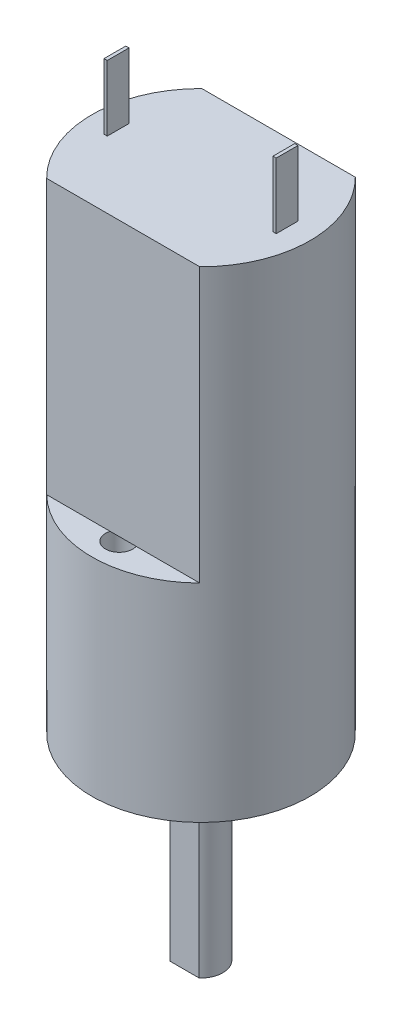
ISO-10303-21;
HEADER;
FILE_DESCRIPTION(('STEP AP214'),'2;1');
FILE_NAME('part.step','',(''),(''),'','','');
FILE_SCHEMA(('AUTOMOTIVE_DESIGN { 1 0 10303 214 1 1 1 1 }'));
ENDSEC;
DATA;
#1=APPLICATION_CONTEXT('core data for automotive mechanical design processes');
#2=APPLICATION_PROTOCOL_DEFINITION('international standard','automotive_design',2000,#1);
#3=PRODUCT_CONTEXT('',#1,'mechanical');
#4=PRODUCT('Part','Part','',(#3));
#5=PRODUCT_RELATED_PRODUCT_CATEGORY('part','',(#4));
#6=PRODUCT_DEFINITION_FORMATION('','',#4);
#7=PRODUCT_DEFINITION_CONTEXT('part definition',#1,'design');
#8=PRODUCT_DEFINITION('design','',#6,#7);
#9=PRODUCT_DEFINITION_SHAPE('','',#8);
#10=(LENGTH_UNIT() NAMED_UNIT(*) SI_UNIT(.MILLI.,.METRE.));
#11=(NAMED_UNIT(*) PLANE_ANGLE_UNIT() SI_UNIT($,.RADIAN.));
#12=(NAMED_UNIT(*) SI_UNIT($,.STERADIAN.) SOLID_ANGLE_UNIT());
#13=UNCERTAINTY_MEASURE_WITH_UNIT(LENGTH_MEASURE(1.E-05),#10,'distance_accuracy_value','');
#14=(GEOMETRIC_REPRESENTATION_CONTEXT(3) GLOBAL_UNCERTAINTY_ASSIGNED_CONTEXT((#13)) GLOBAL_UNIT_ASSIGNED_CONTEXT((#10,
#11,#12)) REPRESENTATION_CONTEXT('',''));
#15=CARTESIAN_POINT('',(0.,0.,0.));
#16=DIRECTION('',(0.,0.,1.));
#17=DIRECTION('',(1.,0.,0.));
#18=AXIS2_PLACEMENT_3D('',#15,#16,#17);
#19=CARTESIAN_POINT('',(0.,25.1,0.));
#20=DIRECTION('',(0.,1.,0.));
#21=DIRECTION('',(-1.,0.,0.));
#22=AXIS2_PLACEMENT_3D('',#19,#20,#21);
#23=PLANE('',#22);
#24=DIRECTION('',(0.,0.,-1.));
#25=VECTOR('',#24,1.);
#26=CARTESIAN_POINT('',(-7.892,25.1,0.));
#27=LINE('',#26,#25);
#28=CARTESIAN_POINT('',(-7.892,25.1,1.));
#29=VERTEX_POINT('',#28);
#30=CARTESIAN_POINT('',(-7.892,25.1,-1.));
#31=VERTEX_POINT('',#30);
#32=EDGE_CURVE('E174',#29,#31,#27,.T.);
#33=ORIENTED_EDGE('',*,*,#32,.T.);
#34=DIRECTION('',(1.,0.,0.));
#35=VECTOR('',#34,1.);
#36=CARTESIAN_POINT('',(-7.742,25.1,-1.));
#37=LINE('',#36,#35);
#38=CARTESIAN_POINT('',(-7.592,25.1,-1.));
#39=VERTEX_POINT('',#38);
#40=EDGE_CURVE('E193',#31,#39,#37,.T.);
#41=ORIENTED_EDGE('',*,*,#40,.T.);
#42=DIRECTION('',(0.,0.,-1.));
#43=VECTOR('',#42,1.);
#44=CARTESIAN_POINT('',(-7.592,25.1,0.));
#45=LINE('',#44,#43);
#46=CARTESIAN_POINT('',(-7.592,25.1,1.));
#47=VERTEX_POINT('',#46);
#48=EDGE_CURVE('E47',#47,#39,#45,.T.);
#49=ORIENTED_EDGE('',*,*,#48,.F.);
#50=DIRECTION('',(1.,0.,0.));
#51=VECTOR('',#50,1.);
#52=CARTESIAN_POINT('',(-7.742,25.1,1.));
#53=LINE('',#52,#51);
#54=EDGE_CURVE('E39',#29,#47,#53,.T.);
#55=ORIENTED_EDGE('',*,*,#54,.F.);
#56=EDGE_LOOP('',(#33,#41,#49,#55));
#57=FACE_BOUND('',#56,.T.);
#58=DIRECTION('',(-1.,0.,0.));
#59=VECTOR('',#58,1.);
#60=CARTESIAN_POINT('',(0.,25.1,7.12912500727686));
#61=LINE('',#60,#59);
#62=CARTESIAN_POINT('',(7.01252997359867,25.1,7.12912500727686));
#63=VERTEX_POINT('',#62);
#64=CARTESIAN_POINT('',(-7.01252997359867,25.1,7.12912500727686));
#65=VERTEX_POINT('',#64);
#66=EDGE_CURVE('E273',#63,#65,#61,.T.);
#67=ORIENTED_EDGE('',*,*,#66,.F.);
#68=CARTESIAN_POINT('',(0.,25.1,0.));
#69=DIRECTION('',(0.,-1.,0.));
#70=DIRECTION('',(0.,0.,-1.));
#71=AXIS2_PLACEMENT_3D('',#68,#69,#70);
#72=CIRCLE('',#71,10.);
#73=CARTESIAN_POINT('',(7.03507838178129,25.1,-7.10687499272314));
#74=VERTEX_POINT('',#73);
#75=EDGE_CURVE('E302',#74,#63,#72,.T.);
#76=ORIENTED_EDGE('',*,*,#75,.F.);
#77=DIRECTION('',(-1.,0.,0.));
#78=VECTOR('',#77,1.);
#79=CARTESIAN_POINT('',(0.,25.1,-7.10687499272314));
#80=LINE('',#79,#78);
#81=CARTESIAN_POINT('',(-7.03507838178129,25.1,-7.10687499272314));
#82=VERTEX_POINT('',#81);
#83=EDGE_CURVE('E250',#74,#82,#80,.T.);
#84=ORIENTED_EDGE('',*,*,#83,.T.);
#85=EDGE_CURVE('E307',#65,#82,#72,.T.);
#86=ORIENTED_EDGE('',*,*,#85,.F.);
#87=EDGE_LOOP('',(#67,#76,#84,#86));
#88=FACE_BOUND('',#87,.T.);
#89=DIRECTION('',(0.,0.,-1.));
#90=VECTOR('',#89,1.);
#91=CARTESIAN_POINT('',(7.892,25.1,0.));
#92=LINE('',#91,#90);
#93=CARTESIAN_POINT('',(7.892,25.1,1.));
#94=VERTEX_POINT('',#93);
#95=CARTESIAN_POINT('',(7.892,25.1,-1.));
#96=VERTEX_POINT('',#95);
#97=EDGE_CURVE('E240',#94,#96,#92,.T.);
#98=ORIENTED_EDGE('',*,*,#97,.F.);
#99=DIRECTION('',(-1.,0.,0.));
#100=VECTOR('',#99,1.);
#101=CARTESIAN_POINT('',(7.742,25.1,1.));
#102=LINE('',#101,#100);
#103=CARTESIAN_POINT('',(7.592,25.1,1.));
#104=VERTEX_POINT('',#103);
#105=EDGE_CURVE('E223',#94,#104,#102,.T.);
#106=ORIENTED_EDGE('',*,*,#105,.T.);
#107=DIRECTION('',(0.,0.,-1.));
#108=VECTOR('',#107,1.);
#109=CARTESIAN_POINT('',(7.592,25.1,0.));
#110=LINE('',#109,#108);
#111=CARTESIAN_POINT('',(7.592,25.1,-1.));
#112=VERTEX_POINT('',#111);
#113=EDGE_CURVE('E177',#104,#112,#110,.T.);
#114=ORIENTED_EDGE('',*,*,#113,.T.);
#115=DIRECTION('',(-1.,0.,0.));
#116=VECTOR('',#115,1.);
#117=CARTESIAN_POINT('',(7.742,25.1,-1.));
#118=LINE('',#117,#116);
#119=EDGE_CURVE('E236',#96,#112,#118,.T.);
#120=ORIENTED_EDGE('',*,*,#119,.F.);
#121=EDGE_LOOP('',(#98,#106,#114,#120));
#122=FACE_BOUND('',#121,.T.);
#123=ADVANCED_FACE('F16',(#57,#88,#122),#23,.T.);
#124=CARTESIAN_POINT('',(0.,0.,0.));
#125=DIRECTION('',(0.,1.,0.));
#126=DIRECTION('',(-1.,0.,0.));
#127=AXIS2_PLACEMENT_3D('',#124,#125,#126);
#128=PLANE('',#127);
#129=DIRECTION('',(-1.,0.,0.));
#130=VECTOR('',#129,1.);
#131=CARTESIAN_POINT('',(0.,0.,-7.10687499272314));
#132=LINE('',#131,#130);
#133=CARTESIAN_POINT('',(1.16849632951965,0.,-7.10687499272314));
#134=VERTEX_POINT('',#133);
#135=CARTESIAN_POINT('',(-1.16849632951965,0.,-7.10687499272314));
#136=VERTEX_POINT('',#135);
#137=EDGE_CURVE('E292',#134,#136,#132,.T.);
#138=ORIENTED_EDGE('',*,*,#137,.F.);
#139=CARTESIAN_POINT('',(0.,0.,-7.55085283890367));
#140=DIRECTION('',(0.,-1.,0.));
#141=DIRECTION('',(0.,0.,-1.));
#142=AXIS2_PLACEMENT_3D('',#139,#140,#141);
#143=CIRCLE('',#142,1.25);
#144=EDGE_CURVE('E359',#134,#136,#143,.T.);
#145=ORIENTED_EDGE('',*,*,#144,.T.);
#146=EDGE_LOOP('',(#138,#145));
#147=FACE_BOUND('',#146,.T.);
#148=ADVANCED_FACE('F413',(#147),#128,.F.);
#149=CARTESIAN_POINT('',(0.,-37.,0.));
#150=DIRECTION('',(0.,1.,0.));
#151=DIRECTION('',(0.,0.,1.));
#152=AXIS2_PLACEMENT_3D('',#149,#150,#151);
#153=CYLINDRICAL_SURFACE('',#152,2.);
#154=CARTESIAN_POINT('',(0.,-22.,0.));
#155=DIRECTION('',(0.,1.,0.));
#156=DIRECTION('',(0.,0.,-1.));
#157=AXIS2_PLACEMENT_3D('',#154,#155,#156);
#158=CIRCLE('',#157,2.);
#159=CARTESIAN_POINT('',(1.32287565553229,-22.,1.5));
#160=VERTEX_POINT('',#159);
#161=CARTESIAN_POINT('',(-1.32287565553229,-22.,1.5));
#162=VERTEX_POINT('',#161);
#163=EDGE_CURVE('E321',#160,#162,#158,.T.);
#164=ORIENTED_EDGE('',*,*,#163,.F.);
#165=DIRECTION('',(0.,-1.,0.));
#166=VECTOR('',#165,1.);
#167=CARTESIAN_POINT('',(1.32287565553229,-22.,1.5));
#168=LINE('',#167,#166);
#169=CARTESIAN_POINT('',(1.32287565553229,-37.,1.5));
#170=VERTEX_POINT('',#169);
#171=EDGE_CURVE('E312',#160,#170,#168,.T.);
#172=ORIENTED_EDGE('',*,*,#171,.T.);
#173=CARTESIAN_POINT('',(0.,-37.,0.));
#174=DIRECTION('',(0.,1.,0.));
#175=DIRECTION('',(0.,0.,-1.));
#176=AXIS2_PLACEMENT_3D('',#173,#174,#175);
#177=CIRCLE('',#176,2.);
#178=CARTESIAN_POINT('',(-1.32287565553229,-37.,1.5));
#179=VERTEX_POINT('',#178);
#180=EDGE_CURVE('E322',#170,#179,#177,.T.);
#181=ORIENTED_EDGE('',*,*,#180,.T.);
#182=DIRECTION('',(0.,-1.,0.));
#183=VECTOR('',#182,1.);
#184=CARTESIAN_POINT('',(-1.32287565553229,-22.,1.5));
#185=LINE('',#184,#183);
#186=EDGE_CURVE('E318',#162,#179,#185,.T.);
#187=ORIENTED_EDGE('',*,*,#186,.F.);
#188=EDGE_LOOP('',(#164,#172,#181,#187));
#189=FACE_BOUND('',#188,.T.);
#190=ADVANCED_FACE('F418',(#189),#153,.T.);
#191=CARTESIAN_POINT('',(0.,-37.,0.));
#192=DIRECTION('',(0.,-1.,0.));
#193=DIRECTION('',(1.,0.,0.));
#194=AXIS2_PLACEMENT_3D('',#191,#192,#193);
#195=PLANE('',#194);
#196=DIRECTION('',(1.,0.,0.));
#197=VECTOR('',#196,1.);
#198=CARTESIAN_POINT('',(0.,-37.,1.5));
#199=LINE('',#198,#197);
#200=EDGE_CURVE('E306',#179,#170,#199,.T.);
#201=ORIENTED_EDGE('',*,*,#200,.F.);
#202=ORIENTED_EDGE('',*,*,#180,.F.);
#203=EDGE_LOOP('',(#201,#202));
#204=FACE_BOUND('',#203,.T.);
#205=ADVANCED_FACE('F433',(#204),#195,.T.);
#206=CARTESIAN_POINT('',(0.,-19.,0.));
#207=DIRECTION('',(0.,1.,0.));
#208=DIRECTION('',(0.,0.,1.));
#209=AXIS2_PLACEMENT_3D('',#206,#207,#208);
#210=CYLINDRICAL_SURFACE('',#209,10.);
#211=CARTESIAN_POINT('',(0.,0.,0.));
#212=DIRECTION('',(0.,-1.,0.));
#213=DIRECTION('',(0.,0.,-1.));
#214=AXIS2_PLACEMENT_3D('',#211,#212,#213);
#215=CIRCLE('',#214,10.);
#216=CARTESIAN_POINT('',(7.01252997359867,0.,7.12912500727686));
#217=VERTEX_POINT('',#216);
#218=CARTESIAN_POINT('',(-7.01252997359867,0.,7.12912500727686));
#219=VERTEX_POINT('',#218);
#220=EDGE_CURVE('E266',#217,#219,#215,.T.);
#221=ORIENTED_EDGE('',*,*,#220,.T.);
#222=DIRECTION('',(0.,1.,0.));
#223=VECTOR('',#222,1.);
#224=CARTESIAN_POINT('',(-7.01252997359867,0.,7.12912500727686));
#225=LINE('',#224,#223);
#226=EDGE_CURVE('E272',#219,#65,#225,.T.);
#227=ORIENTED_EDGE('',*,*,#226,.T.);
#228=ORIENTED_EDGE('',*,*,#85,.T.);
#229=DIRECTION('',(0.,1.,0.));
#230=VECTOR('',#229,1.);
#231=CARTESIAN_POINT('',(-7.03507838178129,0.,-7.10687499272314));
#232=LINE('',#231,#230);
#233=CARTESIAN_POINT('',(-7.03507838178129,0.,-7.10687499272314));
#234=VERTEX_POINT('',#233);
#235=EDGE_CURVE('E288',#234,#82,#232,.T.);
#236=ORIENTED_EDGE('',*,*,#235,.F.);
#237=CARTESIAN_POINT('',(0.,0.,0.));
#238=DIRECTION('',(0.,-1.,0.));
#239=DIRECTION('',(0.,0.,-1.));
#240=AXIS2_PLACEMENT_3D('',#237,#238,#239);
#241=CIRCLE('',#240,10.);
#242=CARTESIAN_POINT('',(7.03507838178129,0.,-7.10687499272314));
#243=VERTEX_POINT('',#242);
#244=EDGE_CURVE('E284',#234,#243,#241,.T.);
#245=ORIENTED_EDGE('',*,*,#244,.T.);
#246=DIRECTION('',(0.,1.,0.));
#247=VECTOR('',#246,1.);
#248=CARTESIAN_POINT('',(7.03507838178129,0.,-7.10687499272314));
#249=LINE('',#248,#247);
#250=EDGE_CURVE('E276',#243,#74,#249,.T.);
#251=ORIENTED_EDGE('',*,*,#250,.T.);
#252=ORIENTED_EDGE('',*,*,#75,.T.);
#253=DIRECTION('',(0.,1.,0.));
#254=VECTOR('',#253,1.);
#255=CARTESIAN_POINT('',(7.01252997359867,0.,7.12912500727686));
#256=LINE('',#255,#254);
#257=EDGE_CURVE('E277',#217,#63,#256,.T.);
#258=ORIENTED_EDGE('',*,*,#257,.F.);
#259=EDGE_LOOP('',(#221,#227,#228,#236,#245,#251,#252,#258));
#260=FACE_BOUND('',#259,.T.);
#261=CARTESIAN_POINT('',(0.,-19.,0.));
#262=DIRECTION('',(0.,-1.,0.));
#263=DIRECTION('',(0.,0.,-1.));
#264=AXIS2_PLACEMENT_3D('',#261,#262,#263);
#265=CIRCLE('',#264,10.);
#266=CARTESIAN_POINT('',(0.,-19.,-10.));
#267=VERTEX_POINT('',#266);
#268=EDGE_CURVE('E26',#267,#267,#265,.T.);
#269=ORIENTED_EDGE('',*,*,#268,.F.);
#270=EDGE_LOOP('',(#269));
#271=FACE_BOUND('',#270,.T.);
#272=ADVANCED_FACE('F18',(#260,#271),#210,.T.);
#273=CARTESIAN_POINT('',(0.,-19.,0.));
#274=DIRECTION('',(0.,-1.,0.));
#275=DIRECTION('',(1.,0.,0.));
#276=AXIS2_PLACEMENT_3D('',#273,#274,#275);
#277=PLANE('',#276);
#278=CARTESIAN_POINT('',(0.,-19.,0.));
#279=DIRECTION('',(0.,-1.,0.));
#280=DIRECTION('',(0.,0.,-1.));
#281=AXIS2_PLACEMENT_3D('',#278,#279,#280);
#282=CIRCLE('',#281,3.5);
#283=CARTESIAN_POINT('',(0.,-19.,-3.5));
#284=VERTEX_POINT('',#283);
#285=EDGE_CURVE('E11',#284,#284,#282,.T.);
#286=ORIENTED_EDGE('',*,*,#285,.F.);
#287=EDGE_LOOP('',(#286));
#288=FACE_BOUND('',#287,.T.);
#289=CARTESIAN_POINT('',(0.,-19.,7.5));
#290=DIRECTION('',(0.,-1.,0.));
#291=DIRECTION('',(0.,0.,-1.));
#292=AXIS2_PLACEMENT_3D('',#289,#290,#291);
#293=CIRCLE('',#292,1.25);
#294=CARTESIAN_POINT('',(0.,-19.,6.25));
#295=VERTEX_POINT('',#294);
#296=EDGE_CURVE('E334',#295,#295,#293,.T.);
#297=ORIENTED_EDGE('',*,*,#296,.F.);
#298=EDGE_LOOP('',(#297));
#299=FACE_BOUND('',#298,.T.);
#300=CARTESIAN_POINT('',(0.,-19.,-7.55085283890367));
#301=DIRECTION('',(0.,-1.,0.));
#302=DIRECTION('',(0.,0.,-1.));
#303=AXIS2_PLACEMENT_3D('',#300,#301,#302);
#304=CIRCLE('',#303,1.25);
#305=CARTESIAN_POINT('',(0.,-19.,-8.80085283890367));
#306=VERTEX_POINT('',#305);
#307=EDGE_CURVE('E339',#306,#306,#304,.T.);
#308=ORIENTED_EDGE('',*,*,#307,.F.);
#309=EDGE_LOOP('',(#308));
#310=FACE_BOUND('',#309,.T.);
#311=CARTESIAN_POINT('',(7.55085330456495,-19.,0.));
#312=DIRECTION('',(0.,-1.,0.));
#313=DIRECTION('',(0.,0.,-1.));
#314=AXIS2_PLACEMENT_3D('',#311,#312,#313);
#315=CIRCLE('',#314,1.25);
#316=CARTESIAN_POINT('',(7.55085330456495,-19.,-1.25));
#317=VERTEX_POINT('',#316);
#318=EDGE_CURVE('E343',#317,#317,#315,.T.);
#319=ORIENTED_EDGE('',*,*,#318,.F.);
#320=EDGE_LOOP('',(#319));
#321=FACE_BOUND('',#320,.T.);
#322=CARTESIAN_POINT('',(-7.47824832797051,-19.,0.));
#323=DIRECTION('',(0.,-1.,0.));
#324=DIRECTION('',(0.,0.,-1.));
#325=AXIS2_PLACEMENT_3D('',#322,#323,#324);
#326=CIRCLE('',#325,1.25);
#327=CARTESIAN_POINT('',(-7.47824832797051,-19.,-1.25));
#328=VERTEX_POINT('',#327);
#329=EDGE_CURVE('E332',#328,#328,#326,.T.);
#330=ORIENTED_EDGE('',*,*,#329,.F.);
#331=EDGE_LOOP('',(#330));
#332=FACE_BOUND('',#331,.T.);
#333=ORIENTED_EDGE('',*,*,#268,.T.);
#334=EDGE_LOOP('',(#333));
#335=FACE_BOUND('',#334,.T.);
#336=ADVANCED_FACE('F451',(#288,#299,#310,#321,#332,#335),#277,.T.);
#337=CARTESIAN_POINT('',(-7.47824832797051,15.0834500748017,0.));
#338=DIRECTION('',(0.,-1.,0.));
#339=DIRECTION('',(0.,0.,-1.));
#340=AXIS2_PLACEMENT_3D('',#337,#338,#339);
#341=CYLINDRICAL_SURFACE('',#340,1.25);
#342=ORIENTED_EDGE('',*,*,#329,.T.);
#343=EDGE_LOOP('',(#342));
#344=FACE_BOUND('',#343,.T.);
#345=CARTESIAN_POINT('',(-7.47824832797051,0.,0.));
#346=DIRECTION('',(0.,-1.,0.));
#347=DIRECTION('',(0.,0.,-1.));
#348=AXIS2_PLACEMENT_3D('',#345,#346,#347);
#349=CIRCLE('',#348,1.25);
#350=CARTESIAN_POINT('',(-7.47824832797051,0.,-1.25));
#351=VERTEX_POINT('',#350);
#352=EDGE_CURVE('E338',#351,#351,#349,.T.);
#353=ORIENTED_EDGE('',*,*,#352,.F.);
#354=EDGE_LOOP('',(#353));
#355=FACE_BOUND('',#354,.T.);
#356=ADVANCED_FACE('F409',(#344,#355),#341,.F.);
#357=CARTESIAN_POINT('',(7.55085330456495,15.0834500748017,0.));
#358=DIRECTION('',(0.,-1.,0.));
#359=DIRECTION('',(0.,0.,-1.));
#360=AXIS2_PLACEMENT_3D('',#357,#358,#359);
#361=CYLINDRICAL_SURFACE('',#360,1.25);
#362=ORIENTED_EDGE('',*,*,#318,.T.);
#363=EDGE_LOOP('',(#362));
#364=FACE_BOUND('',#363,.T.);
#365=CARTESIAN_POINT('',(7.55085330456495,0.,0.));
#366=DIRECTION('',(0.,-1.,0.));
#367=DIRECTION('',(0.,0.,-1.));
#368=AXIS2_PLACEMENT_3D('',#365,#366,#367);
#369=CIRCLE('',#368,1.25);
#370=CARTESIAN_POINT('',(7.55085330456495,0.,-1.25));
#371=VERTEX_POINT('',#370);
#372=EDGE_CURVE('E356',#371,#371,#369,.T.);
#373=ORIENTED_EDGE('',*,*,#372,.F.);
#374=EDGE_LOOP('',(#373));
#375=FACE_BOUND('',#374,.T.);
#376=ADVANCED_FACE('F398',(#364,#375),#361,.F.);
#377=CARTESIAN_POINT('',(0.,15.0834500748017,-7.55085283890367));
#378=DIRECTION('',(0.,-1.,0.));
#379=DIRECTION('',(0.,0.,-1.));
#380=AXIS2_PLACEMENT_3D('',#377,#378,#379);
#381=CYLINDRICAL_SURFACE('',#380,1.25);
#382=ORIENTED_EDGE('',*,*,#307,.T.);
#383=EDGE_LOOP('',(#382));
#384=FACE_BOUND('',#383,.T.);
#385=ORIENTED_EDGE('',*,*,#144,.F.);
#386=EDGE_CURVE('E280',#136,#134,#143,.T.);
#387=ORIENTED_EDGE('',*,*,#386,.F.);
#388=EDGE_LOOP('',(#385,#387));
#389=FACE_BOUND('',#388,.T.);
#390=ADVANCED_FACE('F395',(#384,#389),#381,.F.);
#391=CARTESIAN_POINT('',(0.,15.0834500748017,7.5));
#392=DIRECTION('',(0.,-1.,0.));
#393=DIRECTION('',(0.,0.,-1.));
#394=AXIS2_PLACEMENT_3D('',#391,#392,#393);
#395=CYLINDRICAL_SURFACE('',#394,1.25);
#396=ORIENTED_EDGE('',*,*,#296,.T.);
#397=EDGE_LOOP('',(#396));
#398=FACE_BOUND('',#397,.T.);
#399=CARTESIAN_POINT('',(0.,0.,7.5));
#400=DIRECTION('',(0.,-1.,0.));
#401=DIRECTION('',(0.,0.,-1.));
#402=AXIS2_PLACEMENT_3D('',#399,#400,#401);
#403=CIRCLE('',#402,1.25);
#404=CARTESIAN_POINT('',(1.19371342447533,0.,7.12912500727686));
#405=VERTEX_POINT('',#404);
#406=CARTESIAN_POINT('',(-1.19371342447533,0.,7.12912500727686));
#407=VERTEX_POINT('',#406);
#408=EDGE_CURVE('E20',#405,#407,#403,.T.);
#409=ORIENTED_EDGE('',*,*,#408,.F.);
#410=EDGE_CURVE('E362',#407,#405,#403,.T.);
#411=ORIENTED_EDGE('',*,*,#410,.F.);
#412=EDGE_LOOP('',(#409,#411));
#413=FACE_BOUND('',#412,.T.);
#414=ADVANCED_FACE('F397',(#398,#413),#395,.F.);
#415=CARTESIAN_POINT('',(0.,-22.,0.));
#416=DIRECTION('',(0.,1.,0.));
#417=DIRECTION('',(0.,0.,1.));
#418=AXIS2_PLACEMENT_3D('',#415,#416,#417);
#419=CYLINDRICAL_SURFACE('',#418,3.5);
#420=CARTESIAN_POINT('',(0.,-22.,0.));
#421=DIRECTION('',(0.,-1.,0.));
#422=DIRECTION('',(0.,0.,-1.));
#423=AXIS2_PLACEMENT_3D('',#420,#421,#422);
#424=CIRCLE('',#423,3.5);
#425=CARTESIAN_POINT('',(0.,-22.,-3.5));
#426=VERTEX_POINT('',#425);
#427=EDGE_CURVE('E326',#426,#426,#424,.T.);
#428=ORIENTED_EDGE('',*,*,#427,.F.);
#429=EDGE_LOOP('',(#428));
#430=FACE_BOUND('',#429,.T.);
#431=ORIENTED_EDGE('',*,*,#285,.T.);
#432=EDGE_LOOP('',(#431));
#433=FACE_BOUND('',#432,.T.);
#434=ADVANCED_FACE('F406',(#430,#433),#419,.T.);
#435=CARTESIAN_POINT('',(0.,-22.,0.));
#436=DIRECTION('',(0.,-1.,0.));
#437=DIRECTION('',(1.,0.,0.));
#438=AXIS2_PLACEMENT_3D('',#435,#436,#437);
#439=PLANE('',#438);
#440=ORIENTED_EDGE('',*,*,#163,.T.);
#441=DIRECTION('',(1.,0.,0.));
#442=VECTOR('',#441,1.);
#443=CARTESIAN_POINT('',(0.,-22.,1.5));
#444=LINE('',#443,#442);
#445=EDGE_CURVE('E308',#162,#160,#444,.T.);
#446=ORIENTED_EDGE('',*,*,#445,.T.);
#447=EDGE_LOOP('',(#440,#446));
#448=FACE_BOUND('',#447,.T.);
#449=ORIENTED_EDGE('',*,*,#427,.T.);
#450=EDGE_LOOP('',(#449));
#451=FACE_BOUND('',#450,.T.);
#452=ADVANCED_FACE('F431',(#448,#451),#439,.T.);
#453=CARTESIAN_POINT('',(0.,-22.,1.5));
#454=DIRECTION('',(0.,0.,-1.));
#455=DIRECTION('',(-1.,0.,0.));
#456=AXIS2_PLACEMENT_3D('',#453,#454,#455);
#457=PLANE('',#456);
#458=ORIENTED_EDGE('',*,*,#200,.T.);
#459=ORIENTED_EDGE('',*,*,#171,.F.);
#460=ORIENTED_EDGE('',*,*,#445,.F.);
#461=ORIENTED_EDGE('',*,*,#186,.T.);
#462=EDGE_LOOP('',(#458,#459,#460,#461));
#463=FACE_BOUND('',#462,.T.);
#464=ADVANCED_FACE('F428',(#463),#457,.F.);
#465=ORIENTED_EDGE('',*,*,#352,.T.);
#466=EDGE_LOOP('',(#465));
#467=FACE_BOUND('',#466,.T.);
#468=ADVANCED_FACE('F427',(#467),#128,.F.);
#469=ORIENTED_EDGE('',*,*,#372,.T.);
#470=EDGE_LOOP('',(#469));
#471=FACE_BOUND('',#470,.T.);
#472=ADVANCED_FACE('F420',(#471),#128,.F.);
#473=ORIENTED_EDGE('',*,*,#410,.T.);
#474=DIRECTION('',(-1.,0.,0.));
#475=VECTOR('',#474,1.);
#476=CARTESIAN_POINT('',(0.,0.,7.12912500727686));
#477=LINE('',#476,#475);
#478=EDGE_CURVE('E267',#405,#407,#477,.T.);
#479=ORIENTED_EDGE('',*,*,#478,.T.);
#480=EDGE_LOOP('',(#473,#479));
#481=FACE_BOUND('',#480,.T.);
#482=ADVANCED_FACE('F421',(#481),#128,.F.);
#483=CARTESIAN_POINT('',(0.,0.,0.));
#484=DIRECTION('',(0.,1.,0.));
#485=DIRECTION('',(-1.,0.,0.));
#486=AXIS2_PLACEMENT_3D('',#483,#484,#485);
#487=PLANE('',#486);
#488=ORIENTED_EDGE('',*,*,#386,.T.);
#489=EDGE_CURVE('E289',#243,#134,#132,.T.);
#490=ORIENTED_EDGE('',*,*,#489,.F.);
#491=ORIENTED_EDGE('',*,*,#244,.F.);
#492=EDGE_CURVE('E293',#136,#234,#132,.T.);
#493=ORIENTED_EDGE('',*,*,#492,.F.);
#494=EDGE_LOOP('',(#488,#490,#491,#493));
#495=FACE_BOUND('',#494,.T.);
#496=ADVANCED_FACE('F391',(#495),#487,.T.);
#497=CARTESIAN_POINT('',(0.,0.,-7.10687499272314));
#498=DIRECTION('',(0.,0.,-1.));
#499=DIRECTION('',(-1.,0.,0.));
#500=AXIS2_PLACEMENT_3D('',#497,#498,#499);
#501=PLANE('',#500);
#502=ORIENTED_EDGE('',*,*,#83,.F.);
#503=ORIENTED_EDGE('',*,*,#250,.F.);
#504=ORIENTED_EDGE('',*,*,#489,.T.);
#505=ORIENTED_EDGE('',*,*,#137,.T.);
#506=ORIENTED_EDGE('',*,*,#492,.T.);
#507=ORIENTED_EDGE('',*,*,#235,.T.);
#508=EDGE_LOOP('',(#502,#503,#504,#505,#506,#507));
#509=FACE_BOUND('',#508,.T.);
#510=ADVANCED_FACE('F388',(#509),#501,.T.);
#511=CARTESIAN_POINT('',(0.,0.,0.));
#512=DIRECTION('',(0.,1.,0.));
#513=DIRECTION('',(-1.,0.,0.));
#514=AXIS2_PLACEMENT_3D('',#511,#512,#513);
#515=PLANE('',#514);
#516=ORIENTED_EDGE('',*,*,#408,.T.);
#517=EDGE_CURVE('E268',#407,#219,#477,.T.);
#518=ORIENTED_EDGE('',*,*,#517,.T.);
#519=ORIENTED_EDGE('',*,*,#220,.F.);
#520=EDGE_CURVE('E262',#217,#405,#477,.T.);
#521=ORIENTED_EDGE('',*,*,#520,.T.);
#522=EDGE_LOOP('',(#516,#518,#519,#521));
#523=FACE_BOUND('',#522,.T.);
#524=ADVANCED_FACE('F563',(#523),#515,.T.);
#525=CARTESIAN_POINT('',(0.,0.,7.12912500727686));
#526=DIRECTION('',(0.,0.,-1.));
#527=DIRECTION('',(-1.,0.,0.));
#528=AXIS2_PLACEMENT_3D('',#525,#526,#527);
#529=PLANE('',#528);
#530=ORIENTED_EDGE('',*,*,#66,.T.);
#531=ORIENTED_EDGE('',*,*,#226,.F.);
#532=ORIENTED_EDGE('',*,*,#517,.F.);
#533=ORIENTED_EDGE('',*,*,#478,.F.);
#534=ORIENTED_EDGE('',*,*,#520,.F.);
#535=ORIENTED_EDGE('',*,*,#257,.T.);
#536=EDGE_LOOP('',(#530,#531,#532,#533,#534,#535));
#537=FACE_BOUND('',#536,.T.);
#538=ADVANCED_FACE('F572',(#537),#529,.F.);
#539=CARTESIAN_POINT('',(7.742,31.1,1.));
#540=DIRECTION('',(0.,0.,1.));
#541=DIRECTION('',(1.,0.,0.));
#542=AXIS2_PLACEMENT_3D('',#539,#540,#541);
#543=PLANE('',#542);
#544=ORIENTED_EDGE('',*,*,#105,.F.);
#545=DIRECTION('',(0.,-1.,0.));
#546=VECTOR('',#545,1.);
#547=CARTESIAN_POINT('',(7.892,31.1,1.));
#548=LINE('',#547,#546);
#549=CARTESIAN_POINT('',(7.892,31.1,1.));
#550=VERTEX_POINT('',#549);
#551=EDGE_CURVE('E246',#550,#94,#548,.T.);
#552=ORIENTED_EDGE('',*,*,#551,.F.);
#553=DIRECTION('',(-1.,0.,0.));
#554=VECTOR('',#553,1.);
#555=CARTESIAN_POINT('',(7.742,31.1,1.));
#556=LINE('',#555,#554);
#557=CARTESIAN_POINT('',(7.592,31.1,1.));
#558=VERTEX_POINT('',#557);
#559=EDGE_CURVE('E229',#550,#558,#556,.T.);
#560=ORIENTED_EDGE('',*,*,#559,.T.);
#561=DIRECTION('',(0.,-1.,0.));
#562=VECTOR('',#561,1.);
#563=CARTESIAN_POINT('',(7.592,31.1,1.));
#564=LINE('',#563,#562);
#565=EDGE_CURVE('E233',#558,#104,#564,.T.);
#566=ORIENTED_EDGE('',*,*,#565,.T.);
#567=EDGE_LOOP('',(#544,#552,#560,#566));
#568=FACE_BOUND('',#567,.T.);
#569=ADVANCED_FACE('F583',(#568),#543,.T.);
#570=CARTESIAN_POINT('',(7.892,31.1,0.));
#571=DIRECTION('',(-1.,0.,0.));
#572=DIRECTION('',(0.,0.,1.));
#573=AXIS2_PLACEMENT_3D('',#570,#571,#572);
#574=PLANE('',#573);
#575=ORIENTED_EDGE('',*,*,#97,.T.);
#576=DIRECTION('',(0.,-1.,0.));
#577=VECTOR('',#576,1.);
#578=CARTESIAN_POINT('',(7.892,31.1,-1.));
#579=LINE('',#578,#577);
#580=CARTESIAN_POINT('',(7.892,31.1,-1.));
#581=VERTEX_POINT('',#580);
#582=EDGE_CURVE('E251',#581,#96,#579,.T.);
#583=ORIENTED_EDGE('',*,*,#582,.F.);
#584=DIRECTION('',(0.,0.,-1.));
#585=VECTOR('',#584,1.);
#586=CARTESIAN_POINT('',(7.892,31.1,0.));
#587=LINE('',#586,#585);
#588=EDGE_CURVE('E226',#550,#581,#587,.T.);
#589=ORIENTED_EDGE('',*,*,#588,.F.);
#590=ORIENTED_EDGE('',*,*,#551,.T.);
#591=EDGE_LOOP('',(#575,#583,#589,#590));
#592=FACE_BOUND('',#591,.T.);
#593=ADVANCED_FACE('F594',(#592),#574,.F.);
#594=CARTESIAN_POINT('',(7.742,31.1,-1.));
#595=DIRECTION('',(0.,0.,1.));
#596=DIRECTION('',(1.,0.,0.));
#597=AXIS2_PLACEMENT_3D('',#594,#595,#596);
#598=PLANE('',#597);
#599=ORIENTED_EDGE('',*,*,#119,.T.);
#600=DIRECTION('',(0.,-1.,0.));
#601=VECTOR('',#600,1.);
#602=CARTESIAN_POINT('',(7.592,31.1,-1.));
#603=LINE('',#602,#601);
#604=CARTESIAN_POINT('',(7.592,31.1,-1.));
#605=VERTEX_POINT('',#604);
#606=EDGE_CURVE('E255',#605,#112,#603,.T.);
#607=ORIENTED_EDGE('',*,*,#606,.F.);
#608=DIRECTION('',(-1.,0.,0.));
#609=VECTOR('',#608,1.);
#610=CARTESIAN_POINT('',(7.742,31.1,-1.));
#611=LINE('',#610,#609);
#612=EDGE_CURVE('E222',#581,#605,#611,.T.);
#613=ORIENTED_EDGE('',*,*,#612,.F.);
#614=ORIENTED_EDGE('',*,*,#582,.T.);
#615=EDGE_LOOP('',(#599,#607,#613,#614));
#616=FACE_BOUND('',#615,.T.);
#617=ADVANCED_FACE('F605',(#616),#598,.F.);
#618=CARTESIAN_POINT('',(7.592,31.1,0.));
#619=DIRECTION('',(-1.,0.,0.));
#620=DIRECTION('',(0.,0.,1.));
#621=AXIS2_PLACEMENT_3D('',#618,#619,#620);
#622=PLANE('',#621);
#623=ORIENTED_EDGE('',*,*,#113,.F.);
#624=ORIENTED_EDGE('',*,*,#565,.F.);
#625=DIRECTION('',(0.,0.,-1.));
#626=VECTOR('',#625,1.);
#627=CARTESIAN_POINT('',(7.592,31.1,0.));
#628=LINE('',#627,#626);
#629=EDGE_CURVE('E218',#558,#605,#628,.T.);
#630=ORIENTED_EDGE('',*,*,#629,.T.);
#631=ORIENTED_EDGE('',*,*,#606,.T.);
#632=EDGE_LOOP('',(#623,#624,#630,#631));
#633=FACE_BOUND('',#632,.T.);
#634=ADVANCED_FACE('F616',(#633),#622,.T.);
#635=CARTESIAN_POINT('',(0.,31.1,0.0111250072768604));
#636=DIRECTION('',(0.,1.,0.));
#637=DIRECTION('',(-1.,0.,0.));
#638=AXIS2_PLACEMENT_3D('',#635,#636,#637);
#639=PLANE('',#638);
#640=ORIENTED_EDGE('',*,*,#559,.F.);
#641=ORIENTED_EDGE('',*,*,#588,.T.);
#642=ORIENTED_EDGE('',*,*,#612,.T.);
#643=ORIENTED_EDGE('',*,*,#629,.F.);
#644=EDGE_LOOP('',(#640,#641,#642,#643));
#645=FACE_BOUND('',#644,.T.);
#646=ADVANCED_FACE('F627',(#645),#639,.T.);
#647=CARTESIAN_POINT('',(-7.892,31.1,0.));
#648=DIRECTION('',(-1.,0.,0.));
#649=DIRECTION('',(0.,0.,1.));
#650=AXIS2_PLACEMENT_3D('',#647,#648,#649);
#651=PLANE('',#650);
#652=ORIENTED_EDGE('',*,*,#32,.F.);
#653=DIRECTION('',(0.,-1.,0.));
#654=VECTOR('',#653,1.);
#655=CARTESIAN_POINT('',(-7.892,31.1,1.));
#656=LINE('',#655,#654);
#657=CARTESIAN_POINT('',(-7.892,31.1,1.));
#658=VERTEX_POINT('',#657);
#659=EDGE_CURVE('E167',#658,#29,#656,.T.);
#660=ORIENTED_EDGE('',*,*,#659,.F.);
#661=DIRECTION('',(0.,0.,-1.));
#662=VECTOR('',#661,1.);
#663=CARTESIAN_POINT('',(-7.892,31.1,0.));
#664=LINE('',#663,#662);
#665=CARTESIAN_POINT('',(-7.892,31.1,-1.));
#666=VERTEX_POINT('',#665);
#667=EDGE_CURVE('E172',#658,#666,#664,.T.);
#668=ORIENTED_EDGE('',*,*,#667,.T.);
#669=DIRECTION('',(0.,-1.,0.));
#670=VECTOR('',#669,1.);
#671=CARTESIAN_POINT('',(-7.892,31.1,-1.));
#672=LINE('',#671,#670);
#673=EDGE_CURVE('E204',#666,#31,#672,.T.);
#674=ORIENTED_EDGE('',*,*,#673,.T.);
#675=EDGE_LOOP('',(#652,#660,#668,#674));
#676=FACE_BOUND('',#675,.T.);
#677=ADVANCED_FACE('F169',(#676),#651,.T.);
#678=CARTESIAN_POINT('',(-7.742,31.1,1.));
#679=DIRECTION('',(0.,0.,-1.));
#680=DIRECTION('',(-1.,0.,0.));
#681=AXIS2_PLACEMENT_3D('',#678,#679,#680);
#682=PLANE('',#681);
#683=ORIENTED_EDGE('',*,*,#54,.T.);
#684=DIRECTION('',(0.,-1.,0.));
#685=VECTOR('',#684,1.);
#686=CARTESIAN_POINT('',(-7.592,31.1,1.));
#687=LINE('',#686,#685);
#688=CARTESIAN_POINT('',(-7.592,31.1,1.));
#689=VERTEX_POINT('',#688);
#690=EDGE_CURVE('E178',#689,#47,#687,.T.);
#691=ORIENTED_EDGE('',*,*,#690,.F.);
#692=DIRECTION('',(1.,0.,0.));
#693=VECTOR('',#692,1.);
#694=CARTESIAN_POINT('',(-7.742,31.1,1.));
#695=LINE('',#694,#693);
#696=EDGE_CURVE('E181',#658,#689,#695,.T.);
#697=ORIENTED_EDGE('',*,*,#696,.F.);
#698=ORIENTED_EDGE('',*,*,#659,.T.);
#699=EDGE_LOOP('',(#683,#691,#697,#698));
#700=FACE_BOUND('',#699,.T.);
#701=ADVANCED_FACE('F182',(#700),#682,.F.);
#702=CARTESIAN_POINT('',(-7.592,31.1,0.));
#703=DIRECTION('',(-1.,0.,0.));
#704=DIRECTION('',(0.,0.,1.));
#705=AXIS2_PLACEMENT_3D('',#702,#703,#704);
#706=PLANE('',#705);
#707=ORIENTED_EDGE('',*,*,#48,.T.);
#708=DIRECTION('',(0.,-1.,0.));
#709=VECTOR('',#708,1.);
#710=CARTESIAN_POINT('',(-7.592,31.1,-1.));
#711=LINE('',#710,#709);
#712=CARTESIAN_POINT('',(-7.592,31.1,-1.));
#713=VERTEX_POINT('',#712);
#714=EDGE_CURVE('E212',#713,#39,#711,.T.);
#715=ORIENTED_EDGE('',*,*,#714,.F.);
#716=DIRECTION('',(0.,0.,-1.));
#717=VECTOR('',#716,1.);
#718=CARTESIAN_POINT('',(-7.592,31.1,0.));
#719=LINE('',#718,#717);
#720=EDGE_CURVE('E187',#689,#713,#719,.T.);
#721=ORIENTED_EDGE('',*,*,#720,.F.);
#722=ORIENTED_EDGE('',*,*,#690,.T.);
#723=EDGE_LOOP('',(#707,#715,#721,#722));
#724=FACE_BOUND('',#723,.T.);
#725=ADVANCED_FACE('F657',(#724),#706,.F.);
#726=CARTESIAN_POINT('',(-7.742,31.1,-1.));
#727=DIRECTION('',(0.,0.,-1.));
#728=DIRECTION('',(-1.,0.,0.));
#729=AXIS2_PLACEMENT_3D('',#726,#727,#728);
#730=PLANE('',#729);
#731=ORIENTED_EDGE('',*,*,#40,.F.);
#732=ORIENTED_EDGE('',*,*,#673,.F.);
#733=DIRECTION('',(1.,0.,0.));
#734=VECTOR('',#733,1.);
#735=CARTESIAN_POINT('',(-7.742,31.1,-1.));
#736=LINE('',#735,#734);
#737=EDGE_CURVE('E191',#666,#713,#736,.T.);
#738=ORIENTED_EDGE('',*,*,#737,.T.);
#739=ORIENTED_EDGE('',*,*,#714,.T.);
#740=EDGE_LOOP('',(#731,#732,#738,#739));
#741=FACE_BOUND('',#740,.T.);
#742=ADVANCED_FACE('F667',(#741),#730,.T.);
#743=CARTESIAN_POINT('',(0.,31.1,0.0111250072768604));
#744=DIRECTION('',(0.,1.,0.));
#745=DIRECTION('',(-1.,0.,0.));
#746=AXIS2_PLACEMENT_3D('',#743,#744,#745);
#747=PLANE('',#746);
#748=ORIENTED_EDGE('',*,*,#667,.F.);
#749=ORIENTED_EDGE('',*,*,#696,.T.);
#750=ORIENTED_EDGE('',*,*,#720,.T.);
#751=ORIENTED_EDGE('',*,*,#737,.F.);
#752=EDGE_LOOP('',(#748,#749,#750,#751));
#753=FACE_BOUND('',#752,.T.);
#754=ADVANCED_FACE('F189',(#753),#747,.T.);
#755=CLOSED_SHELL('',(#123,#148,#190,#205,#272,#336,#356,#376,#390,#414,#434,#452,#464,#468,
#472,#482,#496,#510,#524,#538,#569,#593,#617,#634,#646,#677,#701,#725,#742,#754));
#756=MANIFOLD_SOLID_BREP('B1',#755);
#757=ADVANCED_BREP_SHAPE_REPRESENTATION('',(#18,#756),#14);
#758=SHAPE_DEFINITION_REPRESENTATION(#9,#757);
ENDSEC;
END-ISO-10303-21;
